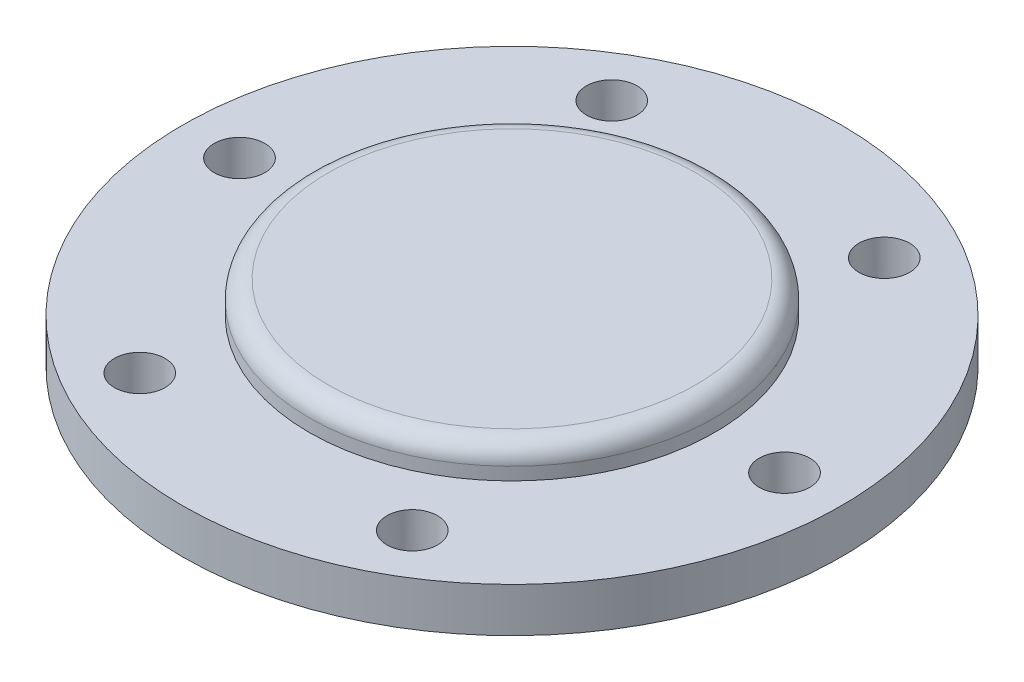
ISO-10303-21;
HEADER;
FILE_DESCRIPTION(('STEP AP214'),'2;1');
FILE_NAME('part.step','',(''),(''),'','','');
FILE_SCHEMA(('AUTOMOTIVE_DESIGN { 1 0 10303 214 1 1 1 1 }'));
ENDSEC;
DATA;
#1=APPLICATION_CONTEXT('core data for automotive mechanical design processes');
#2=APPLICATION_PROTOCOL_DEFINITION('international standard','automotive_design',2000,#1);
#3=PRODUCT_CONTEXT('',#1,'mechanical');
#4=PRODUCT('Part','Part','',(#3));
#5=PRODUCT_RELATED_PRODUCT_CATEGORY('part','',(#4));
#6=PRODUCT_DEFINITION_FORMATION('','',#4);
#7=PRODUCT_DEFINITION_CONTEXT('part definition',#1,'design');
#8=PRODUCT_DEFINITION('design','',#6,#7);
#9=PRODUCT_DEFINITION_SHAPE('','',#8);
#10=(LENGTH_UNIT() NAMED_UNIT(*) SI_UNIT(.MILLI.,.METRE.));
#11=(NAMED_UNIT(*) PLANE_ANGLE_UNIT() SI_UNIT($,.RADIAN.));
#12=(NAMED_UNIT(*) SI_UNIT($,.STERADIAN.) SOLID_ANGLE_UNIT());
#13=UNCERTAINTY_MEASURE_WITH_UNIT(LENGTH_MEASURE(1.E-05),#10,'distance_accuracy_value','');
#14=(GEOMETRIC_REPRESENTATION_CONTEXT(3) GLOBAL_UNCERTAINTY_ASSIGNED_CONTEXT((#13)) GLOBAL_UNIT_ASSIGNED_CONTEXT((#10,
#11,#12)) REPRESENTATION_CONTEXT('',''));
#15=CARTESIAN_POINT('',(0.,0.,0.));
#16=DIRECTION('',(0.,0.,1.));
#17=DIRECTION('',(1.,0.,0.));
#18=AXIS2_PLACEMENT_3D('',#15,#16,#17);
#19=CARTESIAN_POINT('',(16.,1.,0.));
#20=DIRECTION('',(0.,-1.,0.));
#21=DIRECTION('',(0.,0.,-1.));
#22=AXIS2_PLACEMENT_3D('',#19,#20,#21);
#23=PLANE('',#22);
#24=CARTESIAN_POINT('',(-21.5,1.,0.));
#25=DIRECTION('',(0.,-1.,0.));
#26=DIRECTION('',(0.,0.,-1.));
#27=AXIS2_PLACEMENT_3D('',#24,#25,#26);
#28=CIRCLE('',#27,2.);
#29=CARTESIAN_POINT('',(-21.5,1.,-2.));
#30=VERTEX_POINT('',#29);
#31=EDGE_CURVE('E59',#30,#30,#28,.T.);
#32=ORIENTED_EDGE('',*,*,#31,.T.);
#33=EDGE_LOOP('',(#32));
#34=FACE_BOUND('',#33,.T.);
#35=CARTESIAN_POINT('',(-10.7500000000002,1.,-18.6195461813653));
#36=DIRECTION('',(0.,-1.,0.));
#37=DIRECTION('',(0.,0.,-1.));
#38=AXIS2_PLACEMENT_3D('',#35,#36,#37);
#39=CIRCLE('',#38,2.);
#40=CARTESIAN_POINT('',(-10.7500000000002,1.,-20.6195461813653));
#41=VERTEX_POINT('',#40);
#42=EDGE_CURVE('E56',#41,#41,#39,.T.);
#43=ORIENTED_EDGE('',*,*,#42,.T.);
#44=EDGE_LOOP('',(#43));
#45=FACE_BOUND('',#44,.T.);
#46=CARTESIAN_POINT('',(10.7499999999998,1.,-18.6195461813655));
#47=DIRECTION('',(0.,-1.,0.));
#48=DIRECTION('',(0.,0.,-1.));
#49=AXIS2_PLACEMENT_3D('',#46,#47,#48);
#50=CIRCLE('',#49,2.);
#51=CARTESIAN_POINT('',(10.7499999999998,1.,-20.6195461813655));
#52=VERTEX_POINT('',#51);
#53=EDGE_CURVE('E64',#52,#52,#50,.T.);
#54=ORIENTED_EDGE('',*,*,#53,.T.);
#55=EDGE_LOOP('',(#54));
#56=FACE_BOUND('',#55,.T.);
#57=CARTESIAN_POINT('',(21.5,1.,-1.50133697570255E-13));
#58=DIRECTION('',(0.,-1.,0.));
#59=DIRECTION('',(0.,0.,-1.));
#60=AXIS2_PLACEMENT_3D('',#57,#58,#59);
#61=CIRCLE('',#60,2.);
#62=CARTESIAN_POINT('',(21.5,1.,-2.00000000000015));
#63=VERTEX_POINT('',#62);
#64=EDGE_CURVE('E70',#63,#63,#61,.T.);
#65=ORIENTED_EDGE('',*,*,#64,.T.);
#66=EDGE_LOOP('',(#65));
#67=FACE_BOUND('',#66,.T.);
#68=CARTESIAN_POINT('',(10.7500000000001,1.,18.6195461813654));
#69=DIRECTION('',(0.,-1.,0.));
#70=DIRECTION('',(0.,0.,-1.));
#71=AXIS2_PLACEMENT_3D('',#68,#69,#70);
#72=CIRCLE('',#71,2.);
#73=CARTESIAN_POINT('',(10.7500000000001,1.,16.6195461813654));
#74=VERTEX_POINT('',#73);
#75=EDGE_CURVE('E72',#74,#74,#72,.T.);
#76=ORIENTED_EDGE('',*,*,#75,.T.);
#77=EDGE_LOOP('',(#76));
#78=FACE_BOUND('',#77,.T.);
#79=CARTESIAN_POINT('',(-10.75,1.,18.6195461813655));
#80=DIRECTION('',(0.,-1.,0.));
#81=DIRECTION('',(0.,0.,-1.));
#82=AXIS2_PLACEMENT_3D('',#79,#80,#81);
#83=CIRCLE('',#82,2.);
#84=CARTESIAN_POINT('',(-10.75,1.,16.6195461813655));
#85=VERTEX_POINT('',#84);
#86=EDGE_CURVE('E73',#85,#85,#83,.T.);
#87=ORIENTED_EDGE('',*,*,#86,.T.);
#88=EDGE_LOOP('',(#87));
#89=FACE_BOUND('',#88,.T.);
#90=CARTESIAN_POINT('',(0.,0.999999999999998,0.));
#91=DIRECTION('',(0.,1.,0.));
#92=DIRECTION('',(0.,0.,1.));
#93=AXIS2_PLACEMENT_3D('',#90,#91,#92);
#94=CIRCLE('',#93,16.);
#95=CARTESIAN_POINT('',(0.,0.999999999999998,16.));
#96=VERTEX_POINT('',#95);
#97=EDGE_CURVE('E87',#96,#96,#94,.T.);
#98=ORIENTED_EDGE('',*,*,#97,.F.);
#99=EDGE_LOOP('',(#98));
#100=FACE_BOUND('',#99,.T.);
#101=CARTESIAN_POINT('',(0.,1.,0.));
#102=DIRECTION('',(0.,1.,0.));
#103=DIRECTION('',(0.,0.,1.));
#104=AXIS2_PLACEMENT_3D('',#101,#102,#103);
#105=CIRCLE('',#104,26.);
#106=CARTESIAN_POINT('',(0.,1.,26.));
#107=VERTEX_POINT('',#106);
#108=EDGE_CURVE('E48',#107,#107,#105,.T.);
#109=ORIENTED_EDGE('',*,*,#108,.T.);
#110=EDGE_LOOP('',(#109));
#111=FACE_BOUND('',#110,.T.);
#112=ADVANCED_FACE('F40',(#34,#45,#56,#67,#78,#89,#100,#111),#23,.F.);
#113=CARTESIAN_POINT('',(0.,3.49999999999999,0.));
#114=DIRECTION('',(0.,1.,0.));
#115=DIRECTION('',(0.,0.,1.));
#116=AXIS2_PLACEMENT_3D('',#113,#114,#115);
#117=CYLINDRICAL_SURFACE('',#116,26.);
#118=ORIENTED_EDGE('',*,*,#108,.F.);
#119=EDGE_LOOP('',(#118));
#120=FACE_BOUND('',#119,.T.);
#121=CARTESIAN_POINT('',(0.,-2.5,0.));
#122=DIRECTION('',(0.,1.,0.));
#123=DIRECTION('',(0.,0.,1.));
#124=AXIS2_PLACEMENT_3D('',#121,#122,#123);
#125=CIRCLE('',#124,26.);
#126=CARTESIAN_POINT('',(0.,-2.5,26.));
#127=VERTEX_POINT('',#126);
#128=EDGE_CURVE('E55',#127,#127,#125,.T.);
#129=ORIENTED_EDGE('',*,*,#128,.T.);
#130=EDGE_LOOP('',(#129));
#131=FACE_BOUND('',#130,.T.);
#132=ADVANCED_FACE('F123',(#120,#131),#117,.T.);
#133=CARTESIAN_POINT('',(26.,-2.5,0.));
#134=DIRECTION('',(0.,1.,0.));
#135=DIRECTION('',(0.,0.,1.));
#136=AXIS2_PLACEMENT_3D('',#133,#134,#135);
#137=PLANE('',#136);
#138=CARTESIAN_POINT('',(-21.5,-2.5,0.));
#139=DIRECTION('',(0.,1.,0.));
#140=DIRECTION('',(0.,0.,1.));
#141=AXIS2_PLACEMENT_3D('',#138,#139,#140);
#142=CIRCLE('',#141,2.);
#143=CARTESIAN_POINT('',(-21.5,-2.5,2.));
#144=VERTEX_POINT('',#143);
#145=EDGE_CURVE('E54',#144,#144,#142,.T.);
#146=ORIENTED_EDGE('',*,*,#145,.T.);
#147=EDGE_LOOP('',(#146));
#148=FACE_BOUND('',#147,.T.);
#149=CARTESIAN_POINT('',(-10.7500000000002,-2.5,-18.6195461813653));
#150=DIRECTION('',(0.,1.,0.));
#151=DIRECTION('',(0.,0.,1.));
#152=AXIS2_PLACEMENT_3D('',#149,#150,#151);
#153=CIRCLE('',#152,2.);
#154=CARTESIAN_POINT('',(-10.7500000000002,-2.5,-16.6195461813653));
#155=VERTEX_POINT('',#154);
#156=EDGE_CURVE('E58',#155,#155,#153,.T.);
#157=ORIENTED_EDGE('',*,*,#156,.T.);
#158=EDGE_LOOP('',(#157));
#159=FACE_BOUND('',#158,.T.);
#160=CARTESIAN_POINT('',(10.7499999999998,-2.5,-18.6195461813655));
#161=DIRECTION('',(0.,1.,0.));
#162=DIRECTION('',(0.,0.,1.));
#163=AXIS2_PLACEMENT_3D('',#160,#161,#162);
#164=CIRCLE('',#163,2.);
#165=CARTESIAN_POINT('',(10.7499999999998,-2.5,-16.6195461813655));
#166=VERTEX_POINT('',#165);
#167=EDGE_CURVE('E61',#166,#166,#164,.T.);
#168=ORIENTED_EDGE('',*,*,#167,.T.);
#169=EDGE_LOOP('',(#168));
#170=FACE_BOUND('',#169,.T.);
#171=CARTESIAN_POINT('',(21.5,-2.5,-1.50133697570255E-13));
#172=DIRECTION('',(0.,1.,0.));
#173=DIRECTION('',(0.,0.,1.));
#174=AXIS2_PLACEMENT_3D('',#171,#172,#173);
#175=CIRCLE('',#174,2.);
#176=CARTESIAN_POINT('',(21.5,-2.5,1.99999999999985));
#177=VERTEX_POINT('',#176);
#178=EDGE_CURVE('E67',#177,#177,#175,.T.);
#179=ORIENTED_EDGE('',*,*,#178,.T.);
#180=EDGE_LOOP('',(#179));
#181=FACE_BOUND('',#180,.T.);
#182=CARTESIAN_POINT('',(10.7500000000001,-2.5,18.6195461813654));
#183=DIRECTION('',(0.,1.,0.));
#184=DIRECTION('',(0.,0.,1.));
#185=AXIS2_PLACEMENT_3D('',#182,#183,#184);
#186=CIRCLE('',#185,2.);
#187=CARTESIAN_POINT('',(10.7500000000001,-2.5,20.6195461813654));
#188=VERTEX_POINT('',#187);
#189=EDGE_CURVE('E75',#188,#188,#186,.T.);
#190=ORIENTED_EDGE('',*,*,#189,.T.);
#191=EDGE_LOOP('',(#190));
#192=FACE_BOUND('',#191,.T.);
#193=CARTESIAN_POINT('',(-10.75,-2.5,18.6195461813655));
#194=DIRECTION('',(0.,1.,0.));
#195=DIRECTION('',(0.,0.,1.));
#196=AXIS2_PLACEMENT_3D('',#193,#194,#195);
#197=CIRCLE('',#196,2.);
#198=CARTESIAN_POINT('',(-10.75,-2.5,20.6195461813655));
#199=VERTEX_POINT('',#198);
#200=EDGE_CURVE('E77',#199,#199,#197,.T.);
#201=ORIENTED_EDGE('',*,*,#200,.T.);
#202=EDGE_LOOP('',(#201));
#203=FACE_BOUND('',#202,.T.);
#204=ORIENTED_EDGE('',*,*,#128,.F.);
#205=EDGE_LOOP('',(#204));
#206=FACE_BOUND('',#205,.T.);
#207=CARTESIAN_POINT('',(0.,-2.5,0.));
#208=DIRECTION('',(0.,1.,0.));
#209=DIRECTION('',(0.,0.,1.));
#210=AXIS2_PLACEMENT_3D('',#207,#208,#209);
#211=CIRCLE('',#210,15.);
#212=CARTESIAN_POINT('',(0.,-2.5,15.));
#213=VERTEX_POINT('',#212);
#214=EDGE_CURVE('E81',#213,#213,#211,.T.);
#215=ORIENTED_EDGE('',*,*,#214,.T.);
#216=EDGE_LOOP('',(#215));
#217=FACE_BOUND('',#216,.T.);
#218=ADVANCED_FACE('F128',(#148,#159,#170,#181,#192,#203,#206,#217),#137,.F.);
#219=CARTESIAN_POINT('',(0.,3.49999999999999,0.));
#220=DIRECTION('',(0.,1.,0.));
#221=DIRECTION('',(0.,0.,1.));
#222=AXIS2_PLACEMENT_3D('',#219,#220,#221);
#223=CYLINDRICAL_SURFACE('',#222,15.);
#224=ORIENTED_EDGE('',*,*,#214,.F.);
#225=EDGE_LOOP('',(#224));
#226=FACE_BOUND('',#225,.T.);
#227=CARTESIAN_POINT('',(0.,-3.5,0.));
#228=DIRECTION('',(0.,1.,0.));
#229=DIRECTION('',(0.,0.,1.));
#230=AXIS2_PLACEMENT_3D('',#227,#228,#229);
#231=CIRCLE('',#230,15.);
#232=CARTESIAN_POINT('',(0.,-3.5,15.));
#233=VERTEX_POINT('',#232);
#234=EDGE_CURVE('E83',#233,#233,#231,.T.);
#235=ORIENTED_EDGE('',*,*,#234,.T.);
#236=EDGE_LOOP('',(#235));
#237=FACE_BOUND('',#236,.T.);
#238=ADVANCED_FACE('F136',(#226,#237),#223,.T.);
#239=CARTESIAN_POINT('',(15.,-3.5,0.));
#240=DIRECTION('',(0.,1.,0.));
#241=DIRECTION('',(0.,0.,1.));
#242=AXIS2_PLACEMENT_3D('',#239,#240,#241);
#243=PLANE('',#242);
#244=ORIENTED_EDGE('',*,*,#234,.F.);
#245=EDGE_LOOP('',(#244));
#246=FACE_BOUND('',#245,.T.);
#247=ADVANCED_FACE('F139',(#246),#243,.F.);
#248=CARTESIAN_POINT('',(0.,3.5,0.));
#249=DIRECTION('',(0.,-1.,0.));
#250=DIRECTION('',(0.,0.,-1.));
#251=AXIS2_PLACEMENT_3D('',#248,#249,#250);
#252=PLANE('',#251);
#253=CARTESIAN_POINT('',(0.,3.5,0.));
#254=DIRECTION('',(0.,-1.,0.));
#255=DIRECTION('',(0.,0.,-1.));
#256=AXIS2_PLACEMENT_3D('',#253,#254,#255);
#257=CIRCLE('',#256,14.5);
#258=CARTESIAN_POINT('',(0.,3.5,-14.5));
#259=VERTEX_POINT('',#258);
#260=EDGE_CURVE('E42',#259,#259,#257,.F.);
#261=ORIENTED_EDGE('',*,*,#260,.T.);
#262=EDGE_LOOP('',(#261));
#263=FACE_BOUND('',#262,.T.);
#264=ADVANCED_FACE('F116',(#263),#252,.F.);
#265=CARTESIAN_POINT('',(0.,3.49999999999999,0.));
#266=DIRECTION('',(0.,1.,0.));
#267=DIRECTION('',(0.,0.,1.));
#268=AXIS2_PLACEMENT_3D('',#265,#266,#267);
#269=CYLINDRICAL_SURFACE('',#268,16.);
#270=CARTESIAN_POINT('',(0.,2.,0.));
#271=DIRECTION('',(0.,-1.,0.));
#272=DIRECTION('',(0.,0.,-1.));
#273=AXIS2_PLACEMENT_3D('',#270,#271,#272);
#274=CIRCLE('',#273,16.);
#275=CARTESIAN_POINT('',(0.,2.,-16.));
#276=VERTEX_POINT('',#275);
#277=EDGE_CURVE('E10',#276,#276,#274,.T.);
#278=ORIENTED_EDGE('',*,*,#277,.T.);
#279=EDGE_LOOP('',(#278));
#280=FACE_BOUND('',#279,.T.);
#281=ORIENTED_EDGE('',*,*,#97,.T.);
#282=EDGE_LOOP('',(#281));
#283=FACE_BOUND('',#282,.T.);
#284=ADVANCED_FACE('F107',(#280,#283),#269,.T.);
#285=CARTESIAN_POINT('',(-10.75,-3.5,18.6195461813655));
#286=DIRECTION('',(0.,1.,0.));
#287=DIRECTION('',(0.,0.,1.));
#288=AXIS2_PLACEMENT_3D('',#285,#286,#287);
#289=CYLINDRICAL_SURFACE('',#288,2.);
#290=ORIENTED_EDGE('',*,*,#200,.F.);
#291=EDGE_LOOP('',(#290));
#292=FACE_BOUND('',#291,.T.);
#293=ORIENTED_EDGE('',*,*,#86,.F.);
#294=EDGE_LOOP('',(#293));
#295=FACE_BOUND('',#294,.T.);
#296=ADVANCED_FACE('F104',(#292,#295),#289,.F.);
#297=CARTESIAN_POINT('',(10.7500000000001,-3.5,18.6195461813654));
#298=DIRECTION('',(0.,1.,0.));
#299=DIRECTION('',(0.,0.,1.));
#300=AXIS2_PLACEMENT_3D('',#297,#298,#299);
#301=CYLINDRICAL_SURFACE('',#300,2.);
#302=ORIENTED_EDGE('',*,*,#189,.F.);
#303=EDGE_LOOP('',(#302));
#304=FACE_BOUND('',#303,.T.);
#305=ORIENTED_EDGE('',*,*,#75,.F.);
#306=EDGE_LOOP('',(#305));
#307=FACE_BOUND('',#306,.T.);
#308=ADVANCED_FACE('F110',(#304,#307),#301,.F.);
#309=CARTESIAN_POINT('',(21.5,-3.5,-1.50133697570255E-13));
#310=DIRECTION('',(0.,1.,0.));
#311=DIRECTION('',(0.,0.,1.));
#312=AXIS2_PLACEMENT_3D('',#309,#310,#311);
#313=CYLINDRICAL_SURFACE('',#312,2.);
#314=ORIENTED_EDGE('',*,*,#178,.F.);
#315=EDGE_LOOP('',(#314));
#316=FACE_BOUND('',#315,.T.);
#317=ORIENTED_EDGE('',*,*,#64,.F.);
#318=EDGE_LOOP('',(#317));
#319=FACE_BOUND('',#318,.T.);
#320=ADVANCED_FACE('F113',(#316,#319),#313,.F.);
#321=CARTESIAN_POINT('',(10.7499999999998,-3.5,-18.6195461813655));
#322=DIRECTION('',(0.,1.,0.));
#323=DIRECTION('',(0.,0.,1.));
#324=AXIS2_PLACEMENT_3D('',#321,#322,#323);
#325=CYLINDRICAL_SURFACE('',#324,2.);
#326=ORIENTED_EDGE('',*,*,#167,.F.);
#327=EDGE_LOOP('',(#326));
#328=FACE_BOUND('',#327,.T.);
#329=ORIENTED_EDGE('',*,*,#53,.F.);
#330=EDGE_LOOP('',(#329));
#331=FACE_BOUND('',#330,.T.);
#332=ADVANCED_FACE('F148',(#328,#331),#325,.F.);
#333=CARTESIAN_POINT('',(-10.7500000000002,-3.5,-18.6195461813653));
#334=DIRECTION('',(0.,1.,0.));
#335=DIRECTION('',(0.,0.,1.));
#336=AXIS2_PLACEMENT_3D('',#333,#334,#335);
#337=CYLINDRICAL_SURFACE('',#336,2.);
#338=ORIENTED_EDGE('',*,*,#156,.F.);
#339=EDGE_LOOP('',(#338));
#340=FACE_BOUND('',#339,.T.);
#341=ORIENTED_EDGE('',*,*,#42,.F.);
#342=EDGE_LOOP('',(#341));
#343=FACE_BOUND('',#342,.T.);
#344=ADVANCED_FACE('F149',(#340,#343),#337,.F.);
#345=CARTESIAN_POINT('',(-21.5,-3.5,0.));
#346=DIRECTION('',(0.,1.,0.));
#347=DIRECTION('',(0.,0.,1.));
#348=AXIS2_PLACEMENT_3D('',#345,#346,#347);
#349=CYLINDRICAL_SURFACE('',#348,2.);
#350=ORIENTED_EDGE('',*,*,#145,.F.);
#351=EDGE_LOOP('',(#350));
#352=FACE_BOUND('',#351,.T.);
#353=ORIENTED_EDGE('',*,*,#31,.F.);
#354=EDGE_LOOP('',(#353));
#355=FACE_BOUND('',#354,.T.);
#356=ADVANCED_FACE('F190',(#352,#355),#349,.F.);
#357=CARTESIAN_POINT('',(0.,2.,0.));
#358=DIRECTION('',(0.,-1.,0.));
#359=DIRECTION('',(0.,0.,-1.));
#360=AXIS2_PLACEMENT_3D('',#357,#358,#359);
#361=TOROIDAL_SURFACE('',#360,14.5,1.5);
#362=ORIENTED_EDGE('',*,*,#277,.F.);
#363=EDGE_LOOP('',(#362));
#364=FACE_BOUND('',#363,.T.);
#365=ORIENTED_EDGE('',*,*,#260,.F.);
#366=EDGE_LOOP('',(#365));
#367=FACE_BOUND('',#366,.T.);
#368=ADVANCED_FACE('F39',(#364,#367),#361,.T.);
#369=CLOSED_SHELL('',(#112,#132,#218,#238,#247,#264,#284,#296,#308,#320,#332,#344,#356,#368));
#370=MANIFOLD_SOLID_BREP('B2',#369);
#371=ADVANCED_BREP_SHAPE_REPRESENTATION('',(#18,#370),#14);
#372=SHAPE_DEFINITION_REPRESENTATION(#9,#371);
ENDSEC;
END-ISO-10303-21;
